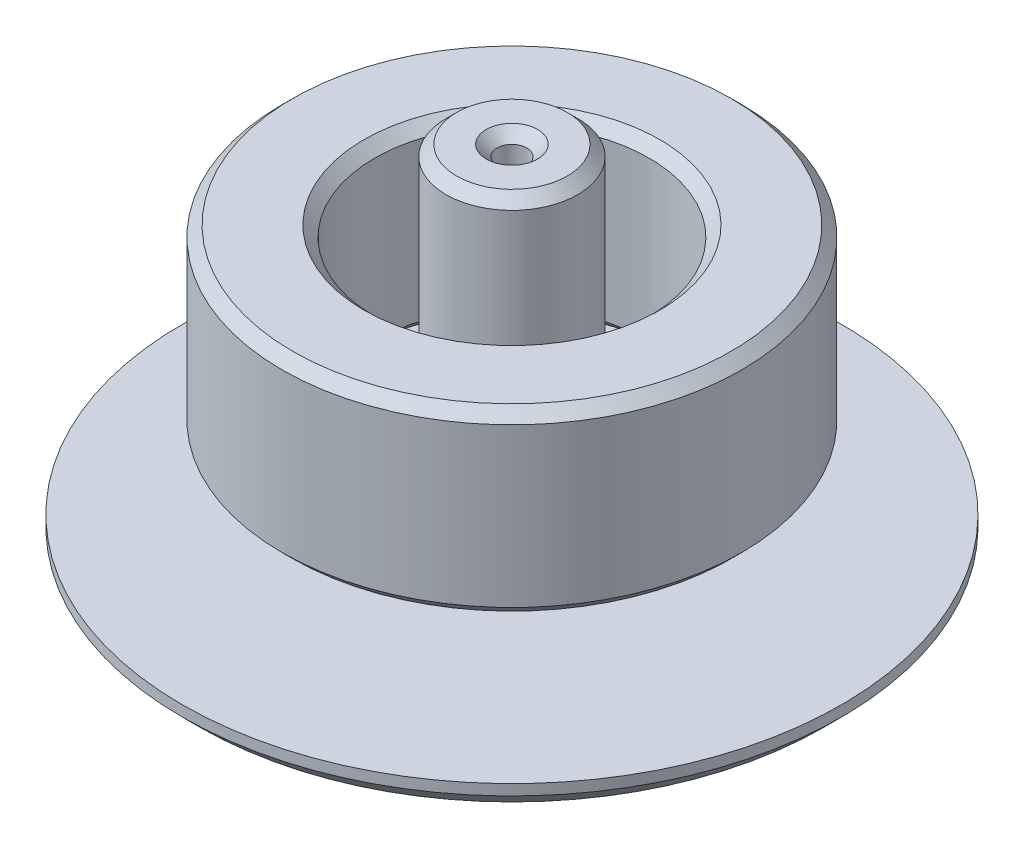
ISO-10303-21;
HEADER;
FILE_DESCRIPTION(('STEP AP214'),'2;1');
FILE_NAME('part.step','',(''),(''),'','','');
FILE_SCHEMA(('AUTOMOTIVE_DESIGN { 1 0 10303 214 1 1 1 1 }'));
ENDSEC;
DATA;
#1=APPLICATION_CONTEXT('core data for automotive mechanical design processes');
#2=APPLICATION_PROTOCOL_DEFINITION('international standard','automotive_design',2000,#1);
#3=PRODUCT_CONTEXT('',#1,'mechanical');
#4=PRODUCT('Part','Part','',(#3));
#5=PRODUCT_RELATED_PRODUCT_CATEGORY('part','',(#4));
#6=PRODUCT_DEFINITION_FORMATION('','',#4);
#7=PRODUCT_DEFINITION_CONTEXT('part definition',#1,'design');
#8=PRODUCT_DEFINITION('design','',#6,#7);
#9=PRODUCT_DEFINITION_SHAPE('','',#8);
#10=(LENGTH_UNIT() NAMED_UNIT(*) SI_UNIT(.MILLI.,.METRE.));
#11=(NAMED_UNIT(*) PLANE_ANGLE_UNIT() SI_UNIT($,.RADIAN.));
#12=(NAMED_UNIT(*) SI_UNIT($,.STERADIAN.) SOLID_ANGLE_UNIT());
#13=UNCERTAINTY_MEASURE_WITH_UNIT(LENGTH_MEASURE(1.E-05),#10,'distance_accuracy_value','');
#14=(GEOMETRIC_REPRESENTATION_CONTEXT(3) GLOBAL_UNCERTAINTY_ASSIGNED_CONTEXT((#13)) GLOBAL_UNIT_ASSIGNED_CONTEXT((#10,
#11,#12)) REPRESENTATION_CONTEXT('',''));
#15=CARTESIAN_POINT('',(0.,0.,0.));
#16=DIRECTION('',(0.,0.,1.));
#17=DIRECTION('',(1.,0.,0.));
#18=AXIS2_PLACEMENT_3D('',#15,#16,#17);
#19=CARTESIAN_POINT('',(0.,-24.1,0.));
#20=DIRECTION('',(0.,1.,0.));
#21=DIRECTION('',(0.,0.,1.));
#22=AXIS2_PLACEMENT_3D('',#19,#20,#21);
#23=CONICAL_SURFACE('',#22,46.25,0.78539816339745);
#24=CARTESIAN_POINT('',(0.,-26.6,0.));
#25=DIRECTION('',(0.,1.,0.));
#26=DIRECTION('',(0.,0.,1.));
#27=AXIS2_PLACEMENT_3D('',#24,#25,#26);
#28=CIRCLE('',#27,43.75);
#29=CARTESIAN_POINT('',(0.,-26.6,43.75));
#30=VERTEX_POINT('',#29);
#31=EDGE_CURVE('E11',#30,#30,#28,.T.);
#32=ORIENTED_EDGE('',*,*,#31,.T.);
#33=EDGE_LOOP('',(#32));
#34=FACE_BOUND('',#33,.T.);
#35=CARTESIAN_POINT('',(0.,-24.1,0.));
#36=DIRECTION('',(0.,1.,0.));
#37=DIRECTION('',(0.,0.,1.));
#38=AXIS2_PLACEMENT_3D('',#35,#36,#37);
#39=CIRCLE('',#38,46.25);
#40=CARTESIAN_POINT('',(0.,-24.1,46.25));
#41=VERTEX_POINT('',#40);
#42=EDGE_CURVE('E82',#41,#41,#39,.T.);
#43=ORIENTED_EDGE('',*,*,#42,.F.);
#44=EDGE_LOOP('',(#43));
#45=FACE_BOUND('',#44,.T.);
#46=ADVANCED_FACE('F45',(#34,#45),#23,.T.);
#47=CARTESIAN_POINT('',(0.,-26.6,43.75));
#48=DIRECTION('',(0.,-1.,0.));
#49=DIRECTION('',(0.,0.,-1.));
#50=AXIS2_PLACEMENT_3D('',#47,#48,#49);
#51=PLANE('',#50);
#52=CARTESIAN_POINT('',(0.,-26.6,0.));
#53=DIRECTION('',(0.,1.,0.));
#54=DIRECTION('',(0.,0.,1.));
#55=AXIS2_PLACEMENT_3D('',#52,#53,#54);
#56=CIRCLE('',#55,4.59999999999999);
#57=CARTESIAN_POINT('',(0.,-26.6,4.59999999999999));
#58=VERTEX_POINT('',#57);
#59=EDGE_CURVE('E51',#58,#58,#56,.T.);
#60=ORIENTED_EDGE('',*,*,#59,.T.);
#61=EDGE_LOOP('',(#60));
#62=FACE_BOUND('',#61,.T.);
#63=ORIENTED_EDGE('',*,*,#31,.F.);
#64=EDGE_LOOP('',(#63));
#65=FACE_BOUND('',#64,.T.);
#66=ADVANCED_FACE('F90',(#62,#65),#51,.T.);
#67=CARTESIAN_POINT('',(0.,-26.6,0.));
#68=DIRECTION('',(0.,-1.,0.));
#69=DIRECTION('',(0.,0.,-1.));
#70=AXIS2_PLACEMENT_3D('',#67,#68,#69);
#71=CONICAL_SURFACE('',#70,4.59999999999999,0.785398163397448);
#72=CARTESIAN_POINT('',(0.,-24.1,0.));
#73=DIRECTION('',(0.,1.,0.));
#74=DIRECTION('',(0.,0.,1.));
#75=AXIS2_PLACEMENT_3D('',#72,#73,#74);
#76=CIRCLE('',#75,2.09999999999999);
#77=CARTESIAN_POINT('',(0.,-24.1,2.09999999999999));
#78=VERTEX_POINT('',#77);
#79=EDGE_CURVE('E55',#78,#78,#76,.T.);
#80=ORIENTED_EDGE('',*,*,#79,.T.);
#81=EDGE_LOOP('',(#80));
#82=FACE_BOUND('',#81,.T.);
#83=ORIENTED_EDGE('',*,*,#59,.F.);
#84=EDGE_LOOP('',(#83));
#85=FACE_BOUND('',#84,.T.);
#86=ADVANCED_FACE('F94',(#82,#85),#71,.F.);
#87=CARTESIAN_POINT('',(0.,44.5664773015121,0.));
#88=DIRECTION('',(0.,1.,0.));
#89=DIRECTION('',(0.,0.,1.));
#90=AXIS2_PLACEMENT_3D('',#87,#88,#89);
#91=CYLINDRICAL_SURFACE('',#90,2.09999999999999);
#92=CARTESIAN_POINT('',(0.,20.9,0.));
#93=DIRECTION('',(0.,1.,0.));
#94=DIRECTION('',(0.,0.,1.));
#95=AXIS2_PLACEMENT_3D('',#92,#93,#94);
#96=CIRCLE('',#95,2.09999999999999);
#97=CARTESIAN_POINT('',(0.,20.9,2.09999999999999));
#98=VERTEX_POINT('',#97);
#99=EDGE_CURVE('E59',#98,#98,#96,.T.);
#100=ORIENTED_EDGE('',*,*,#99,.T.);
#101=EDGE_LOOP('',(#100));
#102=FACE_BOUND('',#101,.T.);
#103=ORIENTED_EDGE('',*,*,#79,.F.);
#104=EDGE_LOOP('',(#103));
#105=FACE_BOUND('',#104,.T.);
#106=ADVANCED_FACE('F98',(#102,#105),#91,.F.);
#107=CARTESIAN_POINT('',(0.,20.9,0.));
#108=DIRECTION('',(0.,1.,0.));
#109=DIRECTION('',(0.,0.,1.));
#110=AXIS2_PLACEMENT_3D('',#107,#108,#109);
#111=CONICAL_SURFACE('',#110,2.09999999999999,0.785398163397447);
#112=CARTESIAN_POINT('',(0.,22.4,0.));
#113=DIRECTION('',(0.,1.,0.));
#114=DIRECTION('',(0.,0.,1.));
#115=AXIS2_PLACEMENT_3D('',#112,#113,#114);
#116=CIRCLE('',#115,3.59999999999999);
#117=CARTESIAN_POINT('',(0.,22.4,3.59999999999999));
#118=VERTEX_POINT('',#117);
#119=EDGE_CURVE('E64',#118,#118,#116,.T.);
#120=ORIENTED_EDGE('',*,*,#119,.T.);
#121=EDGE_LOOP('',(#120));
#122=FACE_BOUND('',#121,.T.);
#123=ORIENTED_EDGE('',*,*,#99,.F.);
#124=EDGE_LOOP('',(#123));
#125=FACE_BOUND('',#124,.T.);
#126=ADVANCED_FACE('F105',(#122,#125),#111,.F.);
#127=CARTESIAN_POINT('',(0.,22.4,3.59999999999999));
#128=DIRECTION('',(0.,1.,0.));
#129=DIRECTION('',(0.,0.,1.));
#130=AXIS2_PLACEMENT_3D('',#127,#128,#129);
#131=PLANE('',#130);
#132=CARTESIAN_POINT('',(0.,22.4,0.));
#133=DIRECTION('',(0.,1.,0.));
#134=DIRECTION('',(0.,0.,1.));
#135=AXIS2_PLACEMENT_3D('',#132,#133,#134);
#136=CIRCLE('',#135,7.74999999999999);
#137=CARTESIAN_POINT('',(0.,22.4,7.74999999999999));
#138=VERTEX_POINT('',#137);
#139=EDGE_CURVE('E67',#138,#138,#136,.T.);
#140=ORIENTED_EDGE('',*,*,#139,.T.);
#141=EDGE_LOOP('',(#140));
#142=FACE_BOUND('',#141,.T.);
#143=ORIENTED_EDGE('',*,*,#119,.F.);
#144=EDGE_LOOP('',(#143));
#145=FACE_BOUND('',#144,.T.);
#146=ADVANCED_FACE('F109',(#142,#145),#131,.T.);
#147=CARTESIAN_POINT('',(0.,22.4,0.));
#148=DIRECTION('',(0.,-1.,0.));
#149=DIRECTION('',(0.,0.,-1.));
#150=AXIS2_PLACEMENT_3D('',#147,#148,#149);
#151=CONICAL_SURFACE('',#150,7.74999999999999,0.785398163397447);
#152=CARTESIAN_POINT('',(0.,20.9,0.));
#153=DIRECTION('',(0.,1.,0.));
#154=DIRECTION('',(0.,0.,1.));
#155=AXIS2_PLACEMENT_3D('',#152,#153,#154);
#156=CIRCLE('',#155,9.24999999999999);
#157=CARTESIAN_POINT('',(0.,20.9,9.24999999999999));
#158=VERTEX_POINT('',#157);
#159=EDGE_CURVE('E70',#158,#158,#156,.T.);
#160=ORIENTED_EDGE('',*,*,#159,.T.);
#161=EDGE_LOOP('',(#160));
#162=FACE_BOUND('',#161,.T.);
#163=ORIENTED_EDGE('',*,*,#139,.F.);
#164=EDGE_LOOP('',(#163));
#165=FACE_BOUND('',#164,.T.);
#166=ADVANCED_FACE('F113',(#162,#165),#151,.T.);
#167=CARTESIAN_POINT('',(0.,44.5664773015121,0.));
#168=DIRECTION('',(0.,1.,0.));
#169=DIRECTION('',(0.,0.,1.));
#170=AXIS2_PLACEMENT_3D('',#167,#168,#169);
#171=CYLINDRICAL_SURFACE('',#170,9.24999999999999);
#172=CARTESIAN_POINT('',(0.,-20.1,0.));
#173=DIRECTION('',(0.,1.,0.));
#174=DIRECTION('',(0.,0.,1.));
#175=AXIS2_PLACEMENT_3D('',#172,#173,#174);
#176=CIRCLE('',#175,9.24999999999999);
#177=CARTESIAN_POINT('',(0.,-20.1,9.24999999999999));
#178=VERTEX_POINT('',#177);
#179=EDGE_CURVE('E73',#178,#178,#176,.T.);
#180=ORIENTED_EDGE('',*,*,#179,.T.);
#181=EDGE_LOOP('',(#180));
#182=FACE_BOUND('',#181,.T.);
#183=ORIENTED_EDGE('',*,*,#159,.F.);
#184=EDGE_LOOP('',(#183));
#185=FACE_BOUND('',#184,.T.);
#186=ADVANCED_FACE('F117',(#182,#185),#171,.T.);
#187=CARTESIAN_POINT('',(0.,-20.1,0.));
#188=DIRECTION('',(0.,-1.,0.));
#189=DIRECTION('',(0.,0.,-1.));
#190=AXIS2_PLACEMENT_3D('',#187,#188,#189);
#191=CONICAL_SURFACE('',#190,9.24999999999999,0.785398163397448);
#192=CARTESIAN_POINT('',(0.,-22.6,0.));
#193=DIRECTION('',(0.,1.,0.));
#194=DIRECTION('',(0.,0.,1.));
#195=AXIS2_PLACEMENT_3D('',#192,#193,#194);
#196=CIRCLE('',#195,11.75);
#197=CARTESIAN_POINT('',(0.,-22.6,11.75));
#198=VERTEX_POINT('',#197);
#199=EDGE_CURVE('E76',#198,#198,#196,.T.);
#200=ORIENTED_EDGE('',*,*,#199,.T.);
#201=EDGE_LOOP('',(#200));
#202=FACE_BOUND('',#201,.T.);
#203=ORIENTED_EDGE('',*,*,#179,.F.);
#204=EDGE_LOOP('',(#203));
#205=FACE_BOUND('',#204,.T.);
#206=ADVANCED_FACE('F121',(#202,#205),#191,.T.);
#207=CARTESIAN_POINT('',(0.,-22.6,39.75));
#208=DIRECTION('',(0.,1.,0.));
#209=DIRECTION('',(0.,0.,1.));
#210=AXIS2_PLACEMENT_3D('',#207,#208,#209);
#211=PLANE('',#210);
#212=CARTESIAN_POINT('',(0.,-22.6,0.));
#213=DIRECTION('',(0.,1.,0.));
#214=DIRECTION('',(0.,0.,1.));
#215=AXIS2_PLACEMENT_3D('',#212,#213,#214);
#216=CIRCLE('',#215,46.25);
#217=CARTESIAN_POINT('',(0.,-22.6,46.25));
#218=VERTEX_POINT('',#217);
#219=EDGE_CURVE('E79',#218,#218,#216,.T.);
#220=ORIENTED_EDGE('',*,*,#219,.T.);
#221=EDGE_LOOP('',(#220));
#222=FACE_BOUND('',#221,.T.);
#223=ORIENTED_EDGE('',*,*,#199,.F.);
#224=EDGE_LOOP('',(#223));
#225=FACE_BOUND('',#224,.T.);
#226=ADVANCED_FACE('F125',(#222,#225),#211,.T.);
#227=CARTESIAN_POINT('',(0.,44.5664773015121,0.));
#228=DIRECTION('',(0.,1.,0.));
#229=DIRECTION('',(0.,0.,1.));
#230=AXIS2_PLACEMENT_3D('',#227,#228,#229);
#231=CYLINDRICAL_SURFACE('',#230,46.25);
#232=ORIENTED_EDGE('',*,*,#42,.T.);
#233=EDGE_LOOP('',(#232));
#234=FACE_BOUND('',#233,.T.);
#235=ORIENTED_EDGE('',*,*,#219,.F.);
#236=EDGE_LOOP('',(#235));
#237=FACE_BOUND('',#236,.T.);
#238=ADVANCED_FACE('F86',(#234,#237),#231,.T.);
#239=CLOSED_SHELL('',(#46,#66,#86,#106,#126,#146,#166,#186,#206,#226,#238));
#240=MANIFOLD_SOLID_BREP('B2',#239);
#241=CARTESIAN_POINT('',(0.,12.6,30.75));
#242=DIRECTION('',(0.,1.,0.));
#243=DIRECTION('',(0.,0.,1.));
#244=AXIS2_PLACEMENT_3D('',#241,#242,#243);
#245=PLANE('',#244);
#246=CARTESIAN_POINT('',(0.,12.6,0.));
#247=DIRECTION('',(0.,1.,0.));
#248=DIRECTION('',(0.,0.,1.));
#249=AXIS2_PLACEMENT_3D('',#246,#247,#248);
#250=CIRCLE('',#249,30.75);
#251=CARTESIAN_POINT('',(0.,12.6,30.75));
#252=VERTEX_POINT('',#251);
#253=EDGE_CURVE('E265',#252,#252,#250,.T.);
#254=ORIENTED_EDGE('',*,*,#253,.T.);
#255=EDGE_LOOP('',(#254));
#256=FACE_BOUND('',#255,.T.);
#257=CARTESIAN_POINT('',(0.,12.6,0.));
#258=DIRECTION('',(0.,1.,0.));
#259=DIRECTION('',(0.,0.,1.));
#260=AXIS2_PLACEMENT_3D('',#257,#258,#259);
#261=CIRCLE('',#260,20.75);
#262=CARTESIAN_POINT('',(0.,12.6,20.75));
#263=VERTEX_POINT('',#262);
#264=EDGE_CURVE('E44',#263,#263,#261,.T.);
#265=ORIENTED_EDGE('',*,*,#264,.F.);
#266=EDGE_LOOP('',(#265));
#267=FACE_BOUND('',#266,.T.);
#268=ADVANCED_FACE('F237',(#256,#267),#245,.T.);
#269=CARTESIAN_POINT('',(0.,11.1,0.));
#270=DIRECTION('',(0.,1.,0.));
#271=DIRECTION('',(0.,0.,1.));
#272=AXIS2_PLACEMENT_3D('',#269,#270,#271);
#273=CONICAL_SURFACE('',#272,19.25,0.785398163397448);
#274=ORIENTED_EDGE('',*,*,#264,.T.);
#275=EDGE_LOOP('',(#274));
#276=FACE_BOUND('',#275,.T.);
#277=CARTESIAN_POINT('',(0.,11.1,0.));
#278=DIRECTION('',(0.,1.,0.));
#279=DIRECTION('',(0.,0.,1.));
#280=AXIS2_PLACEMENT_3D('',#277,#278,#279);
#281=CIRCLE('',#280,19.25);
#282=CARTESIAN_POINT('',(0.,11.1,19.25));
#283=VERTEX_POINT('',#282);
#284=EDGE_CURVE('E243',#283,#283,#281,.T.);
#285=ORIENTED_EDGE('',*,*,#284,.F.);
#286=EDGE_LOOP('',(#285));
#287=FACE_BOUND('',#286,.T.);
#288=ADVANCED_FACE('F283',(#276,#287),#273,.F.);
#289=CARTESIAN_POINT('',(0.,44.5664773015121,0.));
#290=DIRECTION('',(0.,1.,0.));
#291=DIRECTION('',(0.,0.,1.));
#292=AXIS2_PLACEMENT_3D('',#289,#290,#291);
#293=CYLINDRICAL_SURFACE('',#292,19.25);
#294=ORIENTED_EDGE('',*,*,#284,.T.);
#295=EDGE_LOOP('',(#294));
#296=FACE_BOUND('',#295,.T.);
#297=CARTESIAN_POINT('',(0.,-11.1,0.));
#298=DIRECTION('',(0.,1.,0.));
#299=DIRECTION('',(0.,0.,1.));
#300=AXIS2_PLACEMENT_3D('',#297,#298,#299);
#301=CIRCLE('',#300,19.25);
#302=CARTESIAN_POINT('',(0.,-11.1,19.25));
#303=VERTEX_POINT('',#302);
#304=EDGE_CURVE('E247',#303,#303,#301,.T.);
#305=ORIENTED_EDGE('',*,*,#304,.F.);
#306=EDGE_LOOP('',(#305));
#307=FACE_BOUND('',#306,.T.);
#308=ADVANCED_FACE('F287',(#296,#307),#293,.F.);
#309=CARTESIAN_POINT('',(0.,-12.6,0.));
#310=DIRECTION('',(0.,-1.,0.));
#311=DIRECTION('',(0.,0.,-1.));
#312=AXIS2_PLACEMENT_3D('',#309,#310,#311);
#313=CONICAL_SURFACE('',#312,20.75,0.785398163397447);
#314=ORIENTED_EDGE('',*,*,#304,.T.);
#315=EDGE_LOOP('',(#314));
#316=FACE_BOUND('',#315,.T.);
#317=CARTESIAN_POINT('',(0.,-12.6,0.));
#318=DIRECTION('',(0.,1.,0.));
#319=DIRECTION('',(0.,0.,1.));
#320=AXIS2_PLACEMENT_3D('',#317,#318,#319);
#321=CIRCLE('',#320,20.75);
#322=CARTESIAN_POINT('',(0.,-12.6,20.75));
#323=VERTEX_POINT('',#322);
#324=EDGE_CURVE('E251',#323,#323,#321,.T.);
#325=ORIENTED_EDGE('',*,*,#324,.F.);
#326=EDGE_LOOP('',(#325));
#327=FACE_BOUND('',#326,.T.);
#328=ADVANCED_FACE('F291',(#316,#327),#313,.F.);
#329=CARTESIAN_POINT('',(0.,-12.6,30.75));
#330=DIRECTION('',(0.,-1.,0.));
#331=DIRECTION('',(0.,0.,-1.));
#332=AXIS2_PLACEMENT_3D('',#329,#330,#331);
#333=PLANE('',#332);
#334=ORIENTED_EDGE('',*,*,#324,.T.);
#335=EDGE_LOOP('',(#334));
#336=FACE_BOUND('',#335,.T.);
#337=CARTESIAN_POINT('',(0.,-12.6,0.));
#338=DIRECTION('',(0.,1.,0.));
#339=DIRECTION('',(0.,0.,1.));
#340=AXIS2_PLACEMENT_3D('',#337,#338,#339);
#341=CIRCLE('',#340,30.75);
#342=CARTESIAN_POINT('',(0.,-12.6,30.75));
#343=VERTEX_POINT('',#342);
#344=EDGE_CURVE('E256',#343,#343,#341,.T.);
#345=ORIENTED_EDGE('',*,*,#344,.F.);
#346=EDGE_LOOP('',(#345));
#347=FACE_BOUND('',#346,.T.);
#348=ADVANCED_FACE('F297',(#336,#347),#333,.T.);
#349=CARTESIAN_POINT('',(0.,-11.1,0.));
#350=DIRECTION('',(0.,1.,0.));
#351=DIRECTION('',(0.,0.,1.));
#352=AXIS2_PLACEMENT_3D('',#349,#350,#351);
#353=CONICAL_SURFACE('',#352,32.25,0.785398163397446);
#354=ORIENTED_EDGE('',*,*,#344,.T.);
#355=EDGE_LOOP('',(#354));
#356=FACE_BOUND('',#355,.T.);
#357=CARTESIAN_POINT('',(0.,-11.1,0.));
#358=DIRECTION('',(0.,1.,0.));
#359=DIRECTION('',(0.,0.,1.));
#360=AXIS2_PLACEMENT_3D('',#357,#358,#359);
#361=CIRCLE('',#360,32.25);
#362=CARTESIAN_POINT('',(0.,-11.1,32.25));
#363=VERTEX_POINT('',#362);
#364=EDGE_CURVE('E259',#363,#363,#361,.T.);
#365=ORIENTED_EDGE('',*,*,#364,.F.);
#366=EDGE_LOOP('',(#365));
#367=FACE_BOUND('',#366,.T.);
#368=ADVANCED_FACE('F279',(#356,#367),#353,.T.);
#369=CARTESIAN_POINT('',(0.,44.5664773015121,0.));
#370=DIRECTION('',(0.,1.,0.));
#371=DIRECTION('',(0.,0.,1.));
#372=AXIS2_PLACEMENT_3D('',#369,#370,#371);
#373=CYLINDRICAL_SURFACE('',#372,32.25);
#374=ORIENTED_EDGE('',*,*,#364,.T.);
#375=EDGE_LOOP('',(#374));
#376=FACE_BOUND('',#375,.T.);
#377=CARTESIAN_POINT('',(0.,11.1,0.));
#378=DIRECTION('',(0.,1.,0.));
#379=DIRECTION('',(0.,0.,1.));
#380=AXIS2_PLACEMENT_3D('',#377,#378,#379);
#381=CIRCLE('',#380,32.25);
#382=CARTESIAN_POINT('',(0.,11.1,32.25));
#383=VERTEX_POINT('',#382);
#384=EDGE_CURVE('E262',#383,#383,#381,.T.);
#385=ORIENTED_EDGE('',*,*,#384,.F.);
#386=EDGE_LOOP('',(#385));
#387=FACE_BOUND('',#386,.T.);
#388=ADVANCED_FACE('F273',(#376,#387),#373,.T.);
#389=CARTESIAN_POINT('',(0.,12.6,0.));
#390=DIRECTION('',(0.,-1.,0.));
#391=DIRECTION('',(0.,0.,-1.));
#392=AXIS2_PLACEMENT_3D('',#389,#390,#391);
#393=CONICAL_SURFACE('',#392,30.75,0.785398163397448);
#394=ORIENTED_EDGE('',*,*,#384,.T.);
#395=EDGE_LOOP('',(#394));
#396=FACE_BOUND('',#395,.T.);
#397=ORIENTED_EDGE('',*,*,#253,.F.);
#398=EDGE_LOOP('',(#397));
#399=FACE_BOUND('',#398,.T.);
#400=ADVANCED_FACE('F271',(#396,#399),#393,.T.);
#401=CLOSED_SHELL('',(#268,#288,#308,#328,#348,#368,#388,#400));
#402=MANIFOLD_SOLID_BREP('B6',#401);
#403=ADVANCED_BREP_SHAPE_REPRESENTATION('',(#18,#240,#402),#14);
#404=SHAPE_DEFINITION_REPRESENTATION(#9,#403);
ENDSEC;
END-ISO-10303-21;
